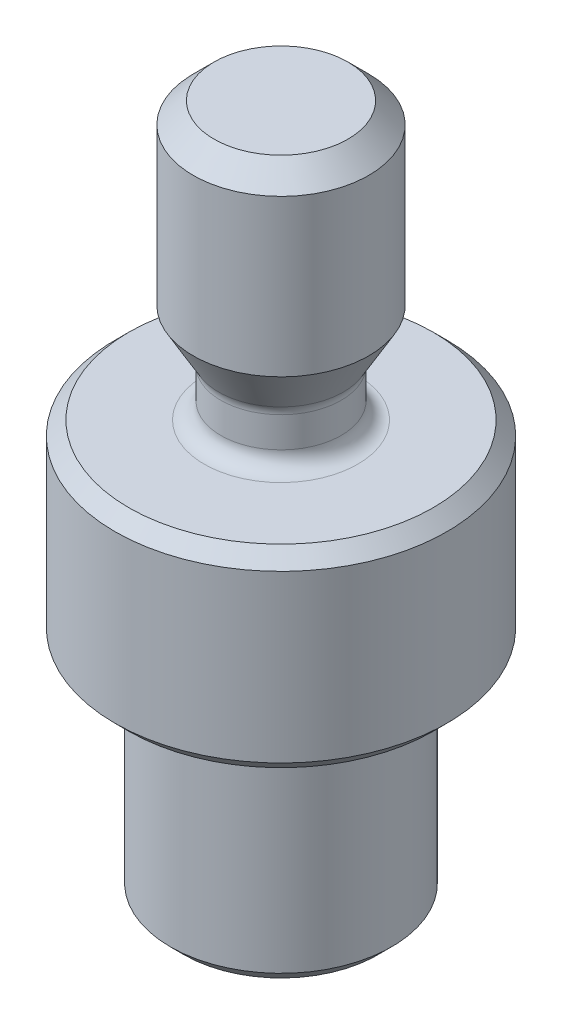
ISO-10303-21;
HEADER;
FILE_DESCRIPTION(('STEP AP214'),'2;1');
FILE_NAME('part.step','',(''),(''),'','','');
FILE_SCHEMA(('AUTOMOTIVE_DESIGN { 1 0 10303 214 1 1 1 1 }'));
ENDSEC;
DATA;
#1=APPLICATION_CONTEXT('core data for automotive mechanical design processes');
#2=APPLICATION_PROTOCOL_DEFINITION('international standard','automotive_design',2000,#1);
#3=PRODUCT_CONTEXT('',#1,'mechanical');
#4=PRODUCT('Part','Part','',(#3));
#5=PRODUCT_RELATED_PRODUCT_CATEGORY('part','',(#4));
#6=PRODUCT_DEFINITION_FORMATION('','',#4);
#7=PRODUCT_DEFINITION_CONTEXT('part definition',#1,'design');
#8=PRODUCT_DEFINITION('design','',#6,#7);
#9=PRODUCT_DEFINITION_SHAPE('','',#8);
#10=(LENGTH_UNIT() NAMED_UNIT(*) SI_UNIT(.MILLI.,.METRE.));
#11=(NAMED_UNIT(*) PLANE_ANGLE_UNIT() SI_UNIT($,.RADIAN.));
#12=(NAMED_UNIT(*) SI_UNIT($,.STERADIAN.) SOLID_ANGLE_UNIT());
#13=UNCERTAINTY_MEASURE_WITH_UNIT(LENGTH_MEASURE(1.E-05),#10,'distance_accuracy_value','');
#14=(GEOMETRIC_REPRESENTATION_CONTEXT(3) GLOBAL_UNCERTAINTY_ASSIGNED_CONTEXT((#13)) GLOBAL_UNIT_ASSIGNED_CONTEXT((#10,
#11,#12)) REPRESENTATION_CONTEXT('',''));
#15=CARTESIAN_POINT('',(0.,0.,0.));
#16=DIRECTION('',(0.,0.,1.));
#17=DIRECTION('',(1.,0.,0.));
#18=AXIS2_PLACEMENT_3D('',#15,#16,#17);
#19=CARTESIAN_POINT('',(-4.,0.,0.));
#20=DIRECTION('',(0.,1.,0.));
#21=DIRECTION('',(0.,0.,1.));
#22=AXIS2_PLACEMENT_3D('',#19,#20,#21);
#23=PLANE('',#22);
#24=CARTESIAN_POINT('',(0.,0.,0.));
#25=DIRECTION('',(0.,1.,0.));
#26=DIRECTION('',(0.,0.,1.));
#27=AXIS2_PLACEMENT_3D('',#24,#25,#26);
#28=CIRCLE('',#27,3.5);
#29=CARTESIAN_POINT('',(0.,0.,3.5));
#30=VERTEX_POINT('',#29);
#31=EDGE_CURVE('E67',#30,#30,#28,.F.);
#32=ORIENTED_EDGE('',*,*,#31,.T.);
#33=EDGE_LOOP('',(#32));
#34=FACE_BOUND('',#33,.T.);
#35=ADVANCED_FACE('F43',(#34),#23,.F.);
#36=CARTESIAN_POINT('',(-4.,15.,0.));
#37=DIRECTION('',(0.,-1.,0.));
#38=DIRECTION('',(0.,0.,-1.));
#39=AXIS2_PLACEMENT_3D('',#36,#37,#38);
#40=PLANE('',#39);
#41=CARTESIAN_POINT('',(0.,15.,0.));
#42=DIRECTION('',(0.,-1.,0.));
#43=DIRECTION('',(0.,0.,-1.));
#44=AXIS2_PLACEMENT_3D('',#41,#42,#43);
#45=CIRCLE('',#44,5.50000000000001);
#46=CARTESIAN_POINT('',(0.,15.,-5.50000000000001));
#47=VERTEX_POINT('',#46);
#48=EDGE_CURVE('E10',#47,#47,#45,.F.);
#49=ORIENTED_EDGE('',*,*,#48,.T.);
#50=EDGE_LOOP('',(#49));
#51=FACE_BOUND('',#50,.T.);
#52=CARTESIAN_POINT('',(0.,15.,0.));
#53=DIRECTION('',(0.,-1.,0.));
#54=DIRECTION('',(0.,0.,-1.));
#55=AXIS2_PLACEMENT_3D('',#52,#53,#54);
#56=CIRCLE('',#55,2.774999784);
#57=CARTESIAN_POINT('',(0.,15.,-2.774999784));
#58=VERTEX_POINT('',#57);
#59=EDGE_CURVE('E85',#58,#58,#56,.T.);
#60=ORIENTED_EDGE('',*,*,#59,.T.);
#61=EDGE_LOOP('',(#60));
#62=FACE_BOUND('',#61,.T.);
#63=ADVANCED_FACE('F117',(#51,#62),#40,.F.);
#64=CARTESIAN_POINT('',(0.,0.,0.));
#65=DIRECTION('',(0.,-1.,0.));
#66=DIRECTION('',(0.,0.,-1.));
#67=AXIS2_PLACEMENT_3D('',#64,#65,#66);
#68=CYLINDRICAL_SURFACE('',#67,6.);
#69=CARTESIAN_POINT('',(0.,8.5,0.));
#70=DIRECTION('',(0.,1.,0.));
#71=DIRECTION('',(0.,0.,1.));
#72=AXIS2_PLACEMENT_3D('',#69,#70,#71);
#73=CIRCLE('',#72,6.);
#74=CARTESIAN_POINT('',(0.,8.5,6.));
#75=VERTEX_POINT('',#74);
#76=EDGE_CURVE('E51',#75,#75,#73,.T.);
#77=ORIENTED_EDGE('',*,*,#76,.T.);
#78=EDGE_LOOP('',(#77));
#79=FACE_BOUND('',#78,.T.);
#80=CARTESIAN_POINT('',(0.,14.5,0.));
#81=DIRECTION('',(0.,-1.,0.));
#82=DIRECTION('',(0.,0.,-1.));
#83=AXIS2_PLACEMENT_3D('',#80,#81,#82);
#84=CIRCLE('',#83,6.);
#85=CARTESIAN_POINT('',(0.,14.5,-6.));
#86=VERTEX_POINT('',#85);
#87=EDGE_CURVE('E55',#86,#86,#84,.T.);
#88=ORIENTED_EDGE('',*,*,#87,.T.);
#89=EDGE_LOOP('',(#88));
#90=FACE_BOUND('',#89,.T.);
#91=ADVANCED_FACE('F122',(#79,#90),#68,.T.);
#92=CARTESIAN_POINT('',(-6.,8.,0.));
#93=DIRECTION('',(0.,1.,0.));
#94=DIRECTION('',(0.,0.,1.));
#95=AXIS2_PLACEMENT_3D('',#92,#93,#94);
#96=PLANE('',#95);
#97=CARTESIAN_POINT('',(0.,8.,0.));
#98=DIRECTION('',(0.,1.,0.));
#99=DIRECTION('',(0.,0.,1.));
#100=AXIS2_PLACEMENT_3D('',#97,#98,#99);
#101=CIRCLE('',#100,5.5);
#102=CARTESIAN_POINT('',(0.,8.,5.5));
#103=VERTEX_POINT('',#102);
#104=EDGE_CURVE('E59',#103,#103,#101,.F.);
#105=ORIENTED_EDGE('',*,*,#104,.T.);
#106=EDGE_LOOP('',(#105));
#107=FACE_BOUND('',#106,.T.);
#108=CARTESIAN_POINT('',(0.,8.,0.));
#109=DIRECTION('',(0.,-1.,0.));
#110=DIRECTION('',(0.,0.,-1.));
#111=AXIS2_PLACEMENT_3D('',#108,#109,#110);
#112=CIRCLE('',#111,4.);
#113=CARTESIAN_POINT('',(0.,8.,-4.));
#114=VERTEX_POINT('',#113);
#115=EDGE_CURVE('E70',#114,#114,#112,.T.);
#116=ORIENTED_EDGE('',*,*,#115,.F.);
#117=EDGE_LOOP('',(#116));
#118=FACE_BOUND('',#117,.T.);
#119=ADVANCED_FACE('F138',(#107,#118),#96,.F.);
#120=CARTESIAN_POINT('',(0.,0.,0.));
#121=DIRECTION('',(0.,-1.,0.));
#122=DIRECTION('',(0.,0.,-1.));
#123=AXIS2_PLACEMENT_3D('',#120,#121,#122);
#124=CYLINDRICAL_SURFACE('',#123,4.);
#125=CARTESIAN_POINT('',(0.,0.500000000000006,0.));
#126=DIRECTION('',(0.,1.,0.));
#127=DIRECTION('',(0.,0.,1.));
#128=AXIS2_PLACEMENT_3D('',#125,#126,#127);
#129=CIRCLE('',#128,4.);
#130=CARTESIAN_POINT('',(0.,0.500000000000006,4.));
#131=VERTEX_POINT('',#130);
#132=EDGE_CURVE('E64',#131,#131,#129,.T.);
#133=ORIENTED_EDGE('',*,*,#132,.T.);
#134=EDGE_LOOP('',(#133));
#135=FACE_BOUND('',#134,.T.);
#136=ORIENTED_EDGE('',*,*,#115,.T.);
#137=EDGE_LOOP('',(#136));
#138=FACE_BOUND('',#137,.T.);
#139=ADVANCED_FACE('F141',(#135,#138),#124,.T.);
#140=CARTESIAN_POINT('',(0.,25.,0.));
#141=DIRECTION('',(0.,-1.,0.));
#142=DIRECTION('',(0.,0.,-1.));
#143=AXIS2_PLACEMENT_3D('',#140,#141,#142);
#144=CYLINDRICAL_SURFACE('',#143,3.175);
#145=CARTESIAN_POINT('',(0.,18.5928222631506,0.));
#146=DIRECTION('',(0.,-1.,0.));
#147=DIRECTION('',(0.,0.,-1.));
#148=AXIS2_PLACEMENT_3D('',#145,#146,#147);
#149=CIRCLE('',#148,3.175);
#150=CARTESIAN_POINT('',(0.,18.5928222631506,-3.175));
#151=VERTEX_POINT('',#150);
#152=EDGE_CURVE('E73',#151,#151,#149,.T.);
#153=ORIENTED_EDGE('',*,*,#152,.F.);
#154=EDGE_LOOP('',(#153));
#155=FACE_BOUND('',#154,.T.);
#156=CARTESIAN_POINT('',(0.,24.24435,0.));
#157=DIRECTION('',(0.,-1.,0.));
#158=DIRECTION('',(0.,0.,-1.));
#159=AXIS2_PLACEMENT_3D('',#156,#157,#158);
#160=CIRCLE('',#159,3.175);
#161=CARTESIAN_POINT('',(0.,24.24435,-3.175));
#162=VERTEX_POINT('',#161);
#163=EDGE_CURVE('E91',#162,#162,#160,.T.);
#164=ORIENTED_EDGE('',*,*,#163,.T.);
#165=EDGE_LOOP('',(#164));
#166=FACE_BOUND('',#165,.T.);
#167=ADVANCED_FACE('F95',(#155,#166),#144,.T.);
#168=CARTESIAN_POINT('',(0.,18.5928222631506,0.));
#169=DIRECTION('',(0.,1.,0.));
#170=DIRECTION('',(0.,0.,1.));
#171=AXIS2_PLACEMENT_3D('',#168,#169,#170);
#172=CONICAL_SURFACE('',#171,3.175,0.523598775598274);
#173=CARTESIAN_POINT('',(0.,17.00000108,0.));
#174=DIRECTION('',(0.,-1.,0.));
#175=DIRECTION('',(0.,0.,-1.));
#176=AXIS2_PLACEMENT_3D('',#173,#174,#175);
#177=CIRCLE('',#176,2.2553842611371);
#178=CARTESIAN_POINT('',(0.,17.00000108,-2.2553842611371));
#179=VERTEX_POINT('',#178);
#180=EDGE_CURVE('E76',#179,#179,#177,.T.);
#181=ORIENTED_EDGE('',*,*,#180,.F.);
#182=EDGE_LOOP('',(#181));
#183=FACE_BOUND('',#182,.T.);
#184=ORIENTED_EDGE('',*,*,#152,.T.);
#185=EDGE_LOOP('',(#184));
#186=FACE_BOUND('',#185,.T.);
#187=ADVANCED_FACE('F152',(#183,#186),#172,.T.);
#188=CARTESIAN_POINT('',(0.,16.700000918,0.));
#189=DIRECTION('',(0.,-1.,0.));
#190=DIRECTION('',(0.,0.,-1.));
#191=AXIS2_PLACEMENT_3D('',#188,#189,#190);
#192=TOROIDAL_SURFACE('',#191,2.774999784,0.600000324);
#193=CARTESIAN_POINT('',(0.,16.700000918,0.));
#194=DIRECTION('',(0.,-1.,0.));
#195=DIRECTION('',(0.,0.,-1.));
#196=AXIS2_PLACEMENT_3D('',#193,#194,#195);
#197=CIRCLE('',#196,2.17499946);
#198=CARTESIAN_POINT('',(0.,16.700000918,-2.17499946));
#199=VERTEX_POINT('',#198);
#200=EDGE_CURVE('E79',#199,#199,#197,.T.);
#201=ORIENTED_EDGE('',*,*,#200,.F.);
#202=EDGE_LOOP('',(#201));
#203=FACE_BOUND('',#202,.T.);
#204=ORIENTED_EDGE('',*,*,#180,.T.);
#205=EDGE_LOOP('',(#204));
#206=FACE_BOUND('',#205,.T.);
#207=ADVANCED_FACE('F191',(#203,#206),#192,.F.);
#208=CARTESIAN_POINT('',(0.,25.,0.));
#209=DIRECTION('',(0.,-1.,0.));
#210=DIRECTION('',(0.,0.,-1.));
#211=AXIS2_PLACEMENT_3D('',#208,#209,#210);
#212=CYLINDRICAL_SURFACE('',#211,2.17499946);
#213=CARTESIAN_POINT('',(0.,15.600000324,0.));
#214=DIRECTION('',(0.,-1.,0.));
#215=DIRECTION('',(0.,0.,-1.));
#216=AXIS2_PLACEMENT_3D('',#213,#214,#215);
#217=CIRCLE('',#216,2.17499946);
#218=CARTESIAN_POINT('',(0.,15.600000324,-2.17499946));
#219=VERTEX_POINT('',#218);
#220=EDGE_CURVE('E82',#219,#219,#217,.T.);
#221=ORIENTED_EDGE('',*,*,#220,.F.);
#222=EDGE_LOOP('',(#221));
#223=FACE_BOUND('',#222,.T.);
#224=ORIENTED_EDGE('',*,*,#200,.T.);
#225=EDGE_LOOP('',(#224));
#226=FACE_BOUND('',#225,.T.);
#227=ADVANCED_FACE('F199',(#223,#226),#212,.T.);
#228=CARTESIAN_POINT('',(0.,15.600000324,0.));
#229=DIRECTION('',(0.,-1.,0.));
#230=DIRECTION('',(0.,0.,-1.));
#231=AXIS2_PLACEMENT_3D('',#228,#229,#230);
#232=TOROIDAL_SURFACE('',#231,2.774999784,0.600000324);
#233=ORIENTED_EDGE('',*,*,#59,.F.);
#234=EDGE_LOOP('',(#233));
#235=FACE_BOUND('',#234,.T.);
#236=ORIENTED_EDGE('',*,*,#220,.T.);
#237=EDGE_LOOP('',(#236));
#238=FACE_BOUND('',#237,.T.);
#239=ADVANCED_FACE('F101',(#235,#238),#232,.F.);
#240=CARTESIAN_POINT('',(0.,25.,0.));
#241=DIRECTION('',(0.,-1.,0.));
#242=DIRECTION('',(0.,0.,-1.));
#243=AXIS2_PLACEMENT_3D('',#240,#241,#242);
#244=CONICAL_SURFACE('',#243,2.41935,0.785398163397455);
#245=ORIENTED_EDGE('',*,*,#163,.F.);
#246=EDGE_LOOP('',(#245));
#247=FACE_BOUND('',#246,.T.);
#248=CARTESIAN_POINT('',(0.,25.,0.));
#249=DIRECTION('',(0.,-1.,0.));
#250=DIRECTION('',(0.,0.,-1.));
#251=AXIS2_PLACEMENT_3D('',#248,#249,#250);
#252=CIRCLE('',#251,2.41935);
#253=CARTESIAN_POINT('',(0.,25.,-2.41935));
#254=VERTEX_POINT('',#253);
#255=EDGE_CURVE('E88',#254,#254,#252,.T.);
#256=ORIENTED_EDGE('',*,*,#255,.T.);
#257=EDGE_LOOP('',(#256));
#258=FACE_BOUND('',#257,.T.);
#259=ADVANCED_FACE('F97',(#247,#258),#244,.T.);
#260=CARTESIAN_POINT('',(0.,25.,0.));
#261=DIRECTION('',(0.,-1.,0.));
#262=DIRECTION('',(0.,0.,-1.));
#263=AXIS2_PLACEMENT_3D('',#260,#261,#262);
#264=PLANE('',#263);
#265=ORIENTED_EDGE('',*,*,#255,.F.);
#266=EDGE_LOOP('',(#265));
#267=FACE_BOUND('',#266,.T.);
#268=ADVANCED_FACE('F100',(#267),#264,.F.);
#269=CARTESIAN_POINT('',(0.,0.,0.));
#270=DIRECTION('',(0.,1.,0.));
#271=DIRECTION('',(0.,0.,1.));
#272=AXIS2_PLACEMENT_3D('',#269,#270,#271);
#273=CONICAL_SURFACE('',#272,3.5,0.785398163397445);
#274=ORIENTED_EDGE('',*,*,#132,.F.);
#275=EDGE_LOOP('',(#274));
#276=FACE_BOUND('',#275,.T.);
#277=ORIENTED_EDGE('',*,*,#31,.F.);
#278=EDGE_LOOP('',(#277));
#279=FACE_BOUND('',#278,.T.);
#280=ADVANCED_FACE('F106',(#276,#279),#273,.T.);
#281=CARTESIAN_POINT('',(0.,8.,0.));
#282=DIRECTION('',(0.,1.,0.));
#283=DIRECTION('',(0.,0.,1.));
#284=AXIS2_PLACEMENT_3D('',#281,#282,#283);
#285=CONICAL_SURFACE('',#284,5.5,0.785398163397445);
#286=ORIENTED_EDGE('',*,*,#76,.F.);
#287=EDGE_LOOP('',(#286));
#288=FACE_BOUND('',#287,.T.);
#289=ORIENTED_EDGE('',*,*,#104,.F.);
#290=EDGE_LOOP('',(#289));
#291=FACE_BOUND('',#290,.T.);
#292=ADVANCED_FACE('F111',(#288,#291),#285,.T.);
#293=CARTESIAN_POINT('',(0.,14.5,0.));
#294=DIRECTION('',(0.,-1.,0.));
#295=DIRECTION('',(0.,0.,-1.));
#296=AXIS2_PLACEMENT_3D('',#293,#294,#295);
#297=CONICAL_SURFACE('',#296,6.,0.785398163397448);
#298=ORIENTED_EDGE('',*,*,#48,.F.);
#299=EDGE_LOOP('',(#298));
#300=FACE_BOUND('',#299,.T.);
#301=ORIENTED_EDGE('',*,*,#87,.F.);
#302=EDGE_LOOP('',(#301));
#303=FACE_BOUND('',#302,.T.);
#304=ADVANCED_FACE('F46',(#300,#303),#297,.T.);
#305=CLOSED_SHELL('',(#35,#63,#91,#119,#139,#167,#187,#207,#227,#239,#259,#268,#280,#292,#304));
#306=MANIFOLD_SOLID_BREP('B2',#305);
#307=ADVANCED_BREP_SHAPE_REPRESENTATION('',(#18,#306),#14);
#308=SHAPE_DEFINITION_REPRESENTATION(#9,#307);
ENDSEC;
END-ISO-10303-21;
